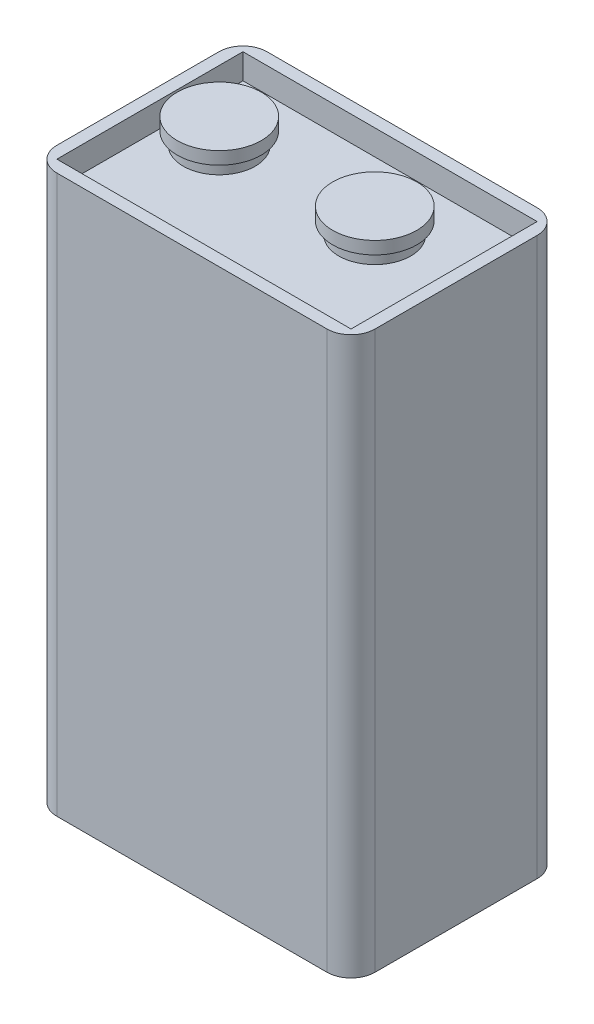
ISO-10303-21;
HEADER;
FILE_DESCRIPTION(('STEP AP214'),'2;1');
FILE_NAME('part.step','',(''),(''),'','','');
FILE_SCHEMA(('AUTOMOTIVE_DESIGN { 1 0 10303 214 1 1 1 1 }'));
ENDSEC;
DATA;
#1=APPLICATION_CONTEXT('core data for automotive mechanical design processes');
#2=APPLICATION_PROTOCOL_DEFINITION('international standard','automotive_design',2000,#1);
#3=PRODUCT_CONTEXT('',#1,'mechanical');
#4=PRODUCT('Part','Part','',(#3));
#5=PRODUCT_RELATED_PRODUCT_CATEGORY('part','',(#4));
#6=PRODUCT_DEFINITION_FORMATION('','',#4);
#7=PRODUCT_DEFINITION_CONTEXT('part definition',#1,'design');
#8=PRODUCT_DEFINITION('design','',#6,#7);
#9=PRODUCT_DEFINITION_SHAPE('','',#8);
#10=(LENGTH_UNIT() NAMED_UNIT(*) SI_UNIT(.MILLI.,.METRE.));
#11=(NAMED_UNIT(*) PLANE_ANGLE_UNIT() SI_UNIT($,.RADIAN.));
#12=(NAMED_UNIT(*) SI_UNIT($,.STERADIAN.) SOLID_ANGLE_UNIT());
#13=UNCERTAINTY_MEASURE_WITH_UNIT(LENGTH_MEASURE(1.E-05),#10,'distance_accuracy_value','');
#14=(GEOMETRIC_REPRESENTATION_CONTEXT(3) GLOBAL_UNCERTAINTY_ASSIGNED_CONTEXT((#13)) GLOBAL_UNIT_ASSIGNED_CONTEXT((#10,
#11,#12)) REPRESENTATION_CONTEXT('',''));
#15=CARTESIAN_POINT('',(0.,0.,0.));
#16=DIRECTION('',(0.,0.,1.));
#17=DIRECTION('',(1.,0.,0.));
#18=AXIS2_PLACEMENT_3D('',#15,#16,#17);
#19=CARTESIAN_POINT('',(1.,-2.1,-1.));
#20=DIRECTION('',(-1.,0.,0.));
#21=DIRECTION('',(0.,0.,1.));
#22=AXIS2_PLACEMENT_3D('',#19,#20,#21);
#23=PLANE('',#22);
#24=DIRECTION('',(0.,0.,1.));
#25=VECTOR('',#24,1.);
#26=CARTESIAN_POINT('',(1.,0.,-1.));
#27=LINE('',#26,#25);
#28=CARTESIAN_POINT('',(1.,0.,-16.5));
#29=VERTEX_POINT('',#28);
#30=CARTESIAN_POINT('',(1.,0.,-1.));
#31=VERTEX_POINT('',#30);
#32=EDGE_CURVE('E131',#29,#31,#27,.T.);
#33=ORIENTED_EDGE('',*,*,#32,.T.);
#34=DIRECTION('',(0.,1.,0.));
#35=VECTOR('',#34,1.);
#36=CARTESIAN_POINT('',(1.,-2.1,-1.));
#37=LINE('',#36,#35);
#38=CARTESIAN_POINT('',(1.,-2.1,-1.));
#39=VERTEX_POINT('',#38);
#40=EDGE_CURVE('E134',#39,#31,#37,.T.);
#41=ORIENTED_EDGE('',*,*,#40,.F.);
#42=DIRECTION('',(0.,0.,1.));
#43=VECTOR('',#42,1.);
#44=CARTESIAN_POINT('',(1.,-2.1,-1.));
#45=LINE('',#44,#43);
#46=CARTESIAN_POINT('',(1.,-2.1,-16.5));
#47=VERTEX_POINT('',#46);
#48=EDGE_CURVE('E150',#47,#39,#45,.T.);
#49=ORIENTED_EDGE('',*,*,#48,.F.);
#50=DIRECTION('',(0.,1.,0.));
#51=VECTOR('',#50,1.);
#52=CARTESIAN_POINT('',(1.,-2.1,-16.5));
#53=LINE('',#52,#51);
#54=EDGE_CURVE('E136',#47,#29,#53,.T.);
#55=ORIENTED_EDGE('',*,*,#54,.T.);
#56=EDGE_LOOP('',(#33,#41,#49,#55));
#57=FACE_BOUND('',#56,.T.);
#58=ADVANCED_FACE('F45',(#57),#23,.F.);
#59=CARTESIAN_POINT('',(1.,-2.1,-16.5));
#60=DIRECTION('',(0.,0.,-1.));
#61=DIRECTION('',(-1.,0.,0.));
#62=AXIS2_PLACEMENT_3D('',#59,#60,#61);
#63=PLANE('',#62);
#64=DIRECTION('',(-1.,0.,0.));
#65=VECTOR('',#64,1.);
#66=CARTESIAN_POINT('',(1.,0.,-16.5));
#67=LINE('',#66,#65);
#68=CARTESIAN_POINT('',(25.5,0.,-16.5));
#69=VERTEX_POINT('',#68);
#70=EDGE_CURVE('E230',#69,#29,#67,.T.);
#71=ORIENTED_EDGE('',*,*,#70,.T.);
#72=ORIENTED_EDGE('',*,*,#54,.F.);
#73=DIRECTION('',(-1.,0.,0.));
#74=VECTOR('',#73,1.);
#75=CARTESIAN_POINT('',(1.,-2.1,-16.5));
#76=LINE('',#75,#74);
#77=CARTESIAN_POINT('',(25.5,-2.1,-16.5));
#78=VERTEX_POINT('',#77);
#79=EDGE_CURVE('E161',#78,#47,#76,.T.);
#80=ORIENTED_EDGE('',*,*,#79,.F.);
#81=DIRECTION('',(0.,1.,0.));
#82=VECTOR('',#81,1.);
#83=CARTESIAN_POINT('',(25.5,-2.1,-16.5));
#84=LINE('',#83,#82);
#85=EDGE_CURVE('E228',#78,#69,#84,.T.);
#86=ORIENTED_EDGE('',*,*,#85,.T.);
#87=EDGE_LOOP('',(#71,#72,#80,#86));
#88=FACE_BOUND('',#87,.T.);
#89=ADVANCED_FACE('F232',(#88),#63,.F.);
#90=CARTESIAN_POINT('',(25.5,-2.1,-1.));
#91=DIRECTION('',(1.,0.,0.));
#92=DIRECTION('',(0.,0.,-1.));
#93=AXIS2_PLACEMENT_3D('',#90,#91,#92);
#94=PLANE('',#93);
#95=DIRECTION('',(0.,0.,-1.));
#96=VECTOR('',#95,1.);
#97=CARTESIAN_POINT('',(25.5,0.,-1.));
#98=LINE('',#97,#96);
#99=CARTESIAN_POINT('',(25.5,0.,-1.));
#100=VERTEX_POINT('',#99);
#101=EDGE_CURVE('E154',#100,#69,#98,.T.);
#102=ORIENTED_EDGE('',*,*,#101,.T.);
#103=ORIENTED_EDGE('',*,*,#85,.F.);
#104=DIRECTION('',(0.,0.,-1.));
#105=VECTOR('',#104,1.);
#106=CARTESIAN_POINT('',(25.5,-2.1,-1.));
#107=LINE('',#106,#105);
#108=CARTESIAN_POINT('',(25.5,-2.1,-1.));
#109=VERTEX_POINT('',#108);
#110=EDGE_CURVE('E165',#109,#78,#107,.T.);
#111=ORIENTED_EDGE('',*,*,#110,.F.);
#112=DIRECTION('',(0.,1.,0.));
#113=VECTOR('',#112,1.);
#114=CARTESIAN_POINT('',(25.5,-2.1,-1.));
#115=LINE('',#114,#113);
#116=EDGE_CURVE('E155',#109,#100,#115,.T.);
#117=ORIENTED_EDGE('',*,*,#116,.T.);
#118=EDGE_LOOP('',(#102,#103,#111,#117));
#119=FACE_BOUND('',#118,.T.);
#120=ADVANCED_FACE('F236',(#119),#94,.F.);
#121=CARTESIAN_POINT('',(1.,-2.1,-1.));
#122=DIRECTION('',(0.,0.,1.));
#123=DIRECTION('',(1.,0.,0.));
#124=AXIS2_PLACEMENT_3D('',#121,#122,#123);
#125=PLANE('',#124);
#126=DIRECTION('',(1.,0.,0.));
#127=VECTOR('',#126,1.);
#128=CARTESIAN_POINT('',(1.,0.,-1.));
#129=LINE('',#128,#127);
#130=EDGE_CURVE('E145',#31,#100,#129,.T.);
#131=ORIENTED_EDGE('',*,*,#130,.T.);
#132=ORIENTED_EDGE('',*,*,#116,.F.);
#133=DIRECTION('',(1.,0.,0.));
#134=VECTOR('',#133,1.);
#135=CARTESIAN_POINT('',(1.,-2.1,-1.));
#136=LINE('',#135,#134);
#137=EDGE_CURVE('E148',#39,#109,#136,.T.);
#138=ORIENTED_EDGE('',*,*,#137,.F.);
#139=ORIENTED_EDGE('',*,*,#40,.T.);
#140=EDGE_LOOP('',(#131,#132,#138,#139));
#141=FACE_BOUND('',#140,.T.);
#142=ADVANCED_FACE('F144',(#141),#125,.F.);
#143=CARTESIAN_POINT('',(0.,-2.1,0.));
#144=DIRECTION('',(0.,-1.,0.));
#145=DIRECTION('',(0.,0.,-1.));
#146=AXIS2_PLACEMENT_3D('',#143,#144,#145);
#147=PLANE('',#146);
#148=ORIENTED_EDGE('',*,*,#48,.T.);
#149=ORIENTED_EDGE('',*,*,#137,.T.);
#150=ORIENTED_EDGE('',*,*,#110,.T.);
#151=ORIENTED_EDGE('',*,*,#79,.T.);
#152=EDGE_LOOP('',(#148,#149,#150,#151));
#153=FACE_BOUND('',#152,.T.);
#154=ADVANCED_FACE('F238',(#153),#147,.F.);
#155=CARTESIAN_POINT('',(0.,-46.4,0.));
#156=DIRECTION('',(0.,-1.,0.));
#157=DIRECTION('',(0.,0.,-1.));
#158=AXIS2_PLACEMENT_3D('',#155,#156,#157);
#159=PLANE('',#158);
#160=DIRECTION('',(1.,0.,0.));
#161=VECTOR('',#160,1.);
#162=CARTESIAN_POINT('',(0.,-46.4,0.));
#163=LINE('',#162,#161);
#164=CARTESIAN_POINT('',(2.,-46.4,0.));
#165=VERTEX_POINT('',#164);
#166=CARTESIAN_POINT('',(24.5,-46.4,0.));
#167=VERTEX_POINT('',#166);
#168=EDGE_CURVE('E218',#165,#167,#163,.T.);
#169=ORIENTED_EDGE('',*,*,#168,.F.);
#170=CARTESIAN_POINT('',(2.,-46.4,-2.));
#171=DIRECTION('',(0.,-1.,0.));
#172=DIRECTION('',(0.,0.,-1.));
#173=AXIS2_PLACEMENT_3D('',#170,#171,#172);
#174=CIRCLE('',#173,2.);
#175=CARTESIAN_POINT('',(0.,-46.4,-2.));
#176=VERTEX_POINT('',#175);
#177=EDGE_CURVE('E12',#165,#176,#174,.T.);
#178=ORIENTED_EDGE('',*,*,#177,.T.);
#179=DIRECTION('',(0.,0.,1.));
#180=VECTOR('',#179,1.);
#181=CARTESIAN_POINT('',(0.,-46.4,0.));
#182=LINE('',#181,#180);
#183=CARTESIAN_POINT('',(0.,-46.4,-15.5));
#184=VERTEX_POINT('',#183);
#185=EDGE_CURVE('E210',#184,#176,#182,.T.);
#186=ORIENTED_EDGE('',*,*,#185,.F.);
#187=CARTESIAN_POINT('',(2.,-46.4,-15.5));
#188=DIRECTION('',(0.,-1.,0.));
#189=DIRECTION('',(0.,0.,-1.));
#190=AXIS2_PLACEMENT_3D('',#187,#188,#189);
#191=CIRCLE('',#190,2.);
#192=CARTESIAN_POINT('',(2.,-46.4,-17.5));
#193=VERTEX_POINT('',#192);
#194=EDGE_CURVE('E197',#184,#193,#191,.T.);
#195=ORIENTED_EDGE('',*,*,#194,.T.);
#196=DIRECTION('',(-1.,0.,0.));
#197=VECTOR('',#196,1.);
#198=CARTESIAN_POINT('',(0.,-46.4,-17.5));
#199=LINE('',#198,#197);
#200=CARTESIAN_POINT('',(24.5,-46.4,-17.5));
#201=VERTEX_POINT('',#200);
#202=EDGE_CURVE('E164',#201,#193,#199,.T.);
#203=ORIENTED_EDGE('',*,*,#202,.F.);
#204=CARTESIAN_POINT('',(24.5,-46.4,-15.5));
#205=DIRECTION('',(0.,-1.,0.));
#206=DIRECTION('',(0.,0.,-1.));
#207=AXIS2_PLACEMENT_3D('',#204,#205,#206);
#208=CIRCLE('',#207,2.);
#209=CARTESIAN_POINT('',(26.5,-46.4,-15.5));
#210=VERTEX_POINT('',#209);
#211=EDGE_CURVE('E188',#201,#210,#208,.T.);
#212=ORIENTED_EDGE('',*,*,#211,.T.);
#213=DIRECTION('',(0.,0.,-1.));
#214=VECTOR('',#213,1.);
#215=CARTESIAN_POINT('',(26.5,-46.4,0.));
#216=LINE('',#215,#214);
#217=CARTESIAN_POINT('',(26.5,-46.4,-2.));
#218=VERTEX_POINT('',#217);
#219=EDGE_CURVE('E224',#218,#210,#216,.T.);
#220=ORIENTED_EDGE('',*,*,#219,.F.);
#221=CARTESIAN_POINT('',(24.5,-46.4,-2.));
#222=DIRECTION('',(0.,-1.,0.));
#223=DIRECTION('',(0.,0.,-1.));
#224=AXIS2_PLACEMENT_3D('',#221,#222,#223);
#225=CIRCLE('',#224,2.);
#226=EDGE_CURVE('E178',#218,#167,#225,.T.);
#227=ORIENTED_EDGE('',*,*,#226,.T.);
#228=EDGE_LOOP('',(#169,#178,#186,#195,#203,#212,#220,#227));
#229=FACE_BOUND('',#228,.T.);
#230=ADVANCED_FACE('F240',(#229),#159,.T.);
#231=CARTESIAN_POINT('',(0.,-46.4,-17.5));
#232=DIRECTION('',(0.,0.,-1.));
#233=DIRECTION('',(-1.,0.,0.));
#234=AXIS2_PLACEMENT_3D('',#231,#232,#233);
#235=PLANE('',#234);
#236=ORIENTED_EDGE('',*,*,#202,.T.);
#237=DIRECTION('',(0.,1.,0.));
#238=VECTOR('',#237,1.);
#239=CARTESIAN_POINT('',(2.,-46.4,-17.5));
#240=LINE('',#239,#238);
#241=CARTESIAN_POINT('',(2.,0.,-17.5));
#242=VERTEX_POINT('',#241);
#243=EDGE_CURVE('E190',#193,#242,#240,.T.);
#244=ORIENTED_EDGE('',*,*,#243,.T.);
#245=DIRECTION('',(-1.,0.,0.));
#246=VECTOR('',#245,1.);
#247=CARTESIAN_POINT('',(0.,0.,-17.5));
#248=LINE('',#247,#246);
#249=CARTESIAN_POINT('',(24.5,0.,-17.5));
#250=VERTEX_POINT('',#249);
#251=EDGE_CURVE('E174',#250,#242,#248,.T.);
#252=ORIENTED_EDGE('',*,*,#251,.F.);
#253=DIRECTION('',(0.,1.,0.));
#254=VECTOR('',#253,1.);
#255=CARTESIAN_POINT('',(24.5,-46.4,-17.5));
#256=LINE('',#255,#254);
#257=EDGE_CURVE('E186',#250,#201,#256,.F.);
#258=ORIENTED_EDGE('',*,*,#257,.T.);
#259=EDGE_LOOP('',(#236,#244,#252,#258));
#260=FACE_BOUND('',#259,.T.);
#261=ADVANCED_FACE('F246',(#260),#235,.T.);
#262=CARTESIAN_POINT('',(26.5,-46.4,0.));
#263=DIRECTION('',(1.,0.,0.));
#264=DIRECTION('',(0.,0.,-1.));
#265=AXIS2_PLACEMENT_3D('',#262,#263,#264);
#266=PLANE('',#265);
#267=ORIENTED_EDGE('',*,*,#219,.T.);
#268=DIRECTION('',(0.,1.,0.));
#269=VECTOR('',#268,1.);
#270=CARTESIAN_POINT('',(26.5,-46.4,-15.5));
#271=LINE('',#270,#269);
#272=CARTESIAN_POINT('',(26.5,0.,-15.5));
#273=VERTEX_POINT('',#272);
#274=EDGE_CURVE('E181',#210,#273,#271,.T.);
#275=ORIENTED_EDGE('',*,*,#274,.T.);
#276=DIRECTION('',(0.,0.,-1.));
#277=VECTOR('',#276,1.);
#278=CARTESIAN_POINT('',(26.5,0.,0.));
#279=LINE('',#278,#277);
#280=CARTESIAN_POINT('',(26.5,0.,-2.));
#281=VERTEX_POINT('',#280);
#282=EDGE_CURVE('E216',#281,#273,#279,.T.);
#283=ORIENTED_EDGE('',*,*,#282,.F.);
#284=DIRECTION('',(0.,1.,0.));
#285=VECTOR('',#284,1.);
#286=CARTESIAN_POINT('',(26.5,-46.4,-2.));
#287=LINE('',#286,#285);
#288=EDGE_CURVE('E176',#281,#218,#287,.F.);
#289=ORIENTED_EDGE('',*,*,#288,.T.);
#290=EDGE_LOOP('',(#267,#275,#283,#289));
#291=FACE_BOUND('',#290,.T.);
#292=ADVANCED_FACE('F293',(#291),#266,.T.);
#293=CARTESIAN_POINT('',(0.,-46.4,0.));
#294=DIRECTION('',(0.,0.,1.));
#295=DIRECTION('',(1.,0.,0.));
#296=AXIS2_PLACEMENT_3D('',#293,#294,#295);
#297=PLANE('',#296);
#298=DIRECTION('',(1.,0.,0.));
#299=VECTOR('',#298,1.);
#300=CARTESIAN_POINT('',(0.,0.,0.));
#301=LINE('',#300,#299);
#302=CARTESIAN_POINT('',(2.,0.,0.));
#303=VERTEX_POINT('',#302);
#304=CARTESIAN_POINT('',(24.5,0.,0.));
#305=VERTEX_POINT('',#304);
#306=EDGE_CURVE('E214',#303,#305,#301,.T.);
#307=ORIENTED_EDGE('',*,*,#306,.F.);
#308=DIRECTION('',(0.,1.,0.));
#309=VECTOR('',#308,1.);
#310=CARTESIAN_POINT('',(2.,-46.4,0.));
#311=LINE('',#310,#309);
#312=EDGE_CURVE('E53',#303,#165,#311,.F.);
#313=ORIENTED_EDGE('',*,*,#312,.T.);
#314=ORIENTED_EDGE('',*,*,#168,.T.);
#315=DIRECTION('',(0.,1.,0.));
#316=VECTOR('',#315,1.);
#317=CARTESIAN_POINT('',(24.5,-46.4,0.));
#318=LINE('',#317,#316);
#319=EDGE_CURVE('E170',#167,#305,#318,.T.);
#320=ORIENTED_EDGE('',*,*,#319,.T.);
#321=EDGE_LOOP('',(#307,#313,#314,#320));
#322=FACE_BOUND('',#321,.T.);
#323=ADVANCED_FACE('F298',(#322),#297,.T.);
#324=CARTESIAN_POINT('',(0.,-46.4,0.));
#325=DIRECTION('',(-1.,0.,0.));
#326=DIRECTION('',(0.,0.,1.));
#327=AXIS2_PLACEMENT_3D('',#324,#325,#326);
#328=PLANE('',#327);
#329=ORIENTED_EDGE('',*,*,#185,.T.);
#330=DIRECTION('',(0.,1.,0.));
#331=VECTOR('',#330,1.);
#332=CARTESIAN_POINT('',(0.,-46.4,-2.));
#333=LINE('',#332,#331);
#334=CARTESIAN_POINT('',(0.,0.,-2.));
#335=VERTEX_POINT('',#334);
#336=EDGE_CURVE('E199',#176,#335,#333,.T.);
#337=ORIENTED_EDGE('',*,*,#336,.T.);
#338=DIRECTION('',(0.,0.,1.));
#339=VECTOR('',#338,1.);
#340=CARTESIAN_POINT('',(0.,0.,0.));
#341=LINE('',#340,#339);
#342=CARTESIAN_POINT('',(0.,0.,-15.5));
#343=VERTEX_POINT('',#342);
#344=EDGE_CURVE('E207',#343,#335,#341,.T.);
#345=ORIENTED_EDGE('',*,*,#344,.F.);
#346=DIRECTION('',(0.,1.,0.));
#347=VECTOR('',#346,1.);
#348=CARTESIAN_POINT('',(0.,-46.4,-15.5));
#349=LINE('',#348,#347);
#350=EDGE_CURVE('E195',#343,#184,#349,.F.);
#351=ORIENTED_EDGE('',*,*,#350,.T.);
#352=EDGE_LOOP('',(#329,#337,#345,#351));
#353=FACE_BOUND('',#352,.T.);
#354=ADVANCED_FACE('F206',(#353),#328,.T.);
#355=CARTESIAN_POINT('',(0.,0.,0.));
#356=DIRECTION('',(0.,-1.,0.));
#357=DIRECTION('',(0.,0.,-1.));
#358=AXIS2_PLACEMENT_3D('',#355,#356,#357);
#359=PLANE('',#358);
#360=ORIENTED_EDGE('',*,*,#130,.F.);
#361=ORIENTED_EDGE('',*,*,#32,.F.);
#362=ORIENTED_EDGE('',*,*,#70,.F.);
#363=ORIENTED_EDGE('',*,*,#101,.F.);
#364=EDGE_LOOP('',(#360,#361,#362,#363));
#365=FACE_BOUND('',#364,.T.);
#366=ORIENTED_EDGE('',*,*,#344,.T.);
#367=CARTESIAN_POINT('',(2.,0.,-2.));
#368=DIRECTION('',(0.,-1.,0.));
#369=DIRECTION('',(0.,0.,-1.));
#370=AXIS2_PLACEMENT_3D('',#367,#368,#369);
#371=CIRCLE('',#370,2.);
#372=EDGE_CURVE('E67',#335,#303,#371,.F.);
#373=ORIENTED_EDGE('',*,*,#372,.T.);
#374=ORIENTED_EDGE('',*,*,#306,.T.);
#375=CARTESIAN_POINT('',(24.5,0.,-2.));
#376=DIRECTION('',(0.,-1.,0.));
#377=DIRECTION('',(0.,0.,-1.));
#378=AXIS2_PLACEMENT_3D('',#375,#376,#377);
#379=CIRCLE('',#378,2.);
#380=EDGE_CURVE('E173',#305,#281,#379,.F.);
#381=ORIENTED_EDGE('',*,*,#380,.T.);
#382=ORIENTED_EDGE('',*,*,#282,.T.);
#383=CARTESIAN_POINT('',(24.5,0.,-15.5));
#384=DIRECTION('',(0.,-1.,0.));
#385=DIRECTION('',(0.,0.,-1.));
#386=AXIS2_PLACEMENT_3D('',#383,#384,#385);
#387=CIRCLE('',#386,2.);
#388=EDGE_CURVE('E184',#273,#250,#387,.F.);
#389=ORIENTED_EDGE('',*,*,#388,.T.);
#390=ORIENTED_EDGE('',*,*,#251,.T.);
#391=CARTESIAN_POINT('',(2.,0.,-15.5));
#392=DIRECTION('',(0.,-1.,0.));
#393=DIRECTION('',(0.,0.,-1.));
#394=AXIS2_PLACEMENT_3D('',#391,#392,#393);
#395=CIRCLE('',#394,2.);
#396=EDGE_CURVE('E193',#242,#343,#395,.F.);
#397=ORIENTED_EDGE('',*,*,#396,.T.);
#398=EDGE_LOOP('',(#366,#373,#374,#381,#382,#389,#390,#397));
#399=FACE_BOUND('',#398,.T.);
#400=ADVANCED_FACE('F152',(#365,#399),#359,.F.);
#401=CARTESIAN_POINT('',(24.5,-46.4,-2.));
#402=DIRECTION('',(0.,1.,0.));
#403=DIRECTION('',(0.,0.,1.));
#404=AXIS2_PLACEMENT_3D('',#401,#402,#403);
#405=CYLINDRICAL_SURFACE('',#404,2.);
#406=ORIENTED_EDGE('',*,*,#226,.F.);
#407=ORIENTED_EDGE('',*,*,#288,.F.);
#408=ORIENTED_EDGE('',*,*,#380,.F.);
#409=ORIENTED_EDGE('',*,*,#319,.F.);
#410=EDGE_LOOP('',(#406,#407,#408,#409));
#411=FACE_BOUND('',#410,.T.);
#412=ADVANCED_FACE('F281',(#411),#405,.T.);
#413=CARTESIAN_POINT('',(24.5,-46.4,-15.5));
#414=DIRECTION('',(0.,1.,0.));
#415=DIRECTION('',(0.,0.,1.));
#416=AXIS2_PLACEMENT_3D('',#413,#414,#415);
#417=CYLINDRICAL_SURFACE('',#416,2.);
#418=ORIENTED_EDGE('',*,*,#211,.F.);
#419=ORIENTED_EDGE('',*,*,#257,.F.);
#420=ORIENTED_EDGE('',*,*,#388,.F.);
#421=ORIENTED_EDGE('',*,*,#274,.F.);
#422=EDGE_LOOP('',(#418,#419,#420,#421));
#423=FACE_BOUND('',#422,.T.);
#424=ADVANCED_FACE('F285',(#423),#417,.T.);
#425=CARTESIAN_POINT('',(2.,-46.4,-15.5));
#426=DIRECTION('',(0.,1.,0.));
#427=DIRECTION('',(0.,0.,1.));
#428=AXIS2_PLACEMENT_3D('',#425,#426,#427);
#429=CYLINDRICAL_SURFACE('',#428,2.);
#430=ORIENTED_EDGE('',*,*,#194,.F.);
#431=ORIENTED_EDGE('',*,*,#350,.F.);
#432=ORIENTED_EDGE('',*,*,#396,.F.);
#433=ORIENTED_EDGE('',*,*,#243,.F.);
#434=EDGE_LOOP('',(#430,#431,#432,#433));
#435=FACE_BOUND('',#434,.T.);
#436=ADVANCED_FACE('F308',(#435),#429,.T.);
#437=CARTESIAN_POINT('',(2.,-46.4,-2.));
#438=DIRECTION('',(0.,1.,0.));
#439=DIRECTION('',(0.,0.,1.));
#440=AXIS2_PLACEMENT_3D('',#437,#438,#439);
#441=CYLINDRICAL_SURFACE('',#440,2.);
#442=ORIENTED_EDGE('',*,*,#177,.F.);
#443=ORIENTED_EDGE('',*,*,#312,.F.);
#444=ORIENTED_EDGE('',*,*,#372,.F.);
#445=ORIENTED_EDGE('',*,*,#336,.F.);
#446=EDGE_LOOP('',(#442,#443,#444,#445));
#447=FACE_BOUND('',#446,.T.);
#448=ADVANCED_FACE('F47',(#447),#441,.T.);
#449=CLOSED_SHELL('',(#58,#89,#120,#142,#154,#230,#261,#292,#323,#354,#400,#412,#424,#436,#448));
#450=MANIFOLD_SOLID_BREP('B2',#449);
#451=CARTESIAN_POINT('',(19.725,1.05,-8.75));
#452=DIRECTION('',(0.,-1.,0.));
#453=DIRECTION('',(0.,0.,-1.));
#454=AXIS2_PLACEMENT_3D('',#451,#452,#453);
#455=CYLINDRICAL_SURFACE('',#454,3.);
#456=CARTESIAN_POINT('',(19.725,1.05,-8.75));
#457=DIRECTION('',(0.,1.,0.));
#458=DIRECTION('',(0.,0.,1.));
#459=AXIS2_PLACEMENT_3D('',#456,#457,#458);
#460=CIRCLE('',#459,3.);
#461=CARTESIAN_POINT('',(19.725,1.05,-5.75000000000001));
#462=VERTEX_POINT('',#461);
#463=EDGE_CURVE('E405',#462,#462,#460,.T.);
#464=ORIENTED_EDGE('',*,*,#463,.F.);
#465=EDGE_LOOP('',(#464));
#466=FACE_BOUND('',#465,.T.);
#467=CARTESIAN_POINT('',(19.725,0.,-8.75));
#468=DIRECTION('',(0.,-1.,0.));
#469=DIRECTION('',(0.,0.,-1.));
#470=AXIS2_PLACEMENT_3D('',#467,#468,#469);
#471=CIRCLE('',#470,3.);
#472=CARTESIAN_POINT('',(19.725,0.,-11.75));
#473=VERTEX_POINT('',#472);
#474=EDGE_CURVE('E44',#473,#473,#471,.T.);
#475=ORIENTED_EDGE('',*,*,#474,.F.);
#476=EDGE_LOOP('',(#475));
#477=FACE_BOUND('',#476,.T.);
#478=ADVANCED_FACE('F398',(#466,#477),#455,.T.);
#479=CARTESIAN_POINT('',(19.725,2.1,-8.75));
#480=DIRECTION('',(0.,-1.,0.));
#481=DIRECTION('',(0.,0.,-1.));
#482=AXIS2_PLACEMENT_3D('',#479,#480,#481);
#483=CYLINDRICAL_SURFACE('',#482,3.5);
#484=CARTESIAN_POINT('',(19.725,2.1,-8.75));
#485=DIRECTION('',(0.,1.,0.));
#486=DIRECTION('',(0.,0.,1.));
#487=AXIS2_PLACEMENT_3D('',#484,#485,#486);
#488=CIRCLE('',#487,3.5);
#489=CARTESIAN_POINT('',(19.725,2.1,-5.25));
#490=VERTEX_POINT('',#489);
#491=EDGE_CURVE('E409',#490,#490,#488,.T.);
#492=ORIENTED_EDGE('',*,*,#491,.F.);
#493=EDGE_LOOP('',(#492));
#494=FACE_BOUND('',#493,.T.);
#495=CARTESIAN_POINT('',(19.725,1.05,-8.75));
#496=DIRECTION('',(0.,1.,0.));
#497=DIRECTION('',(0.,0.,1.));
#498=AXIS2_PLACEMENT_3D('',#495,#496,#497);
#499=CIRCLE('',#498,3.5);
#500=CARTESIAN_POINT('',(19.725,1.05,-5.25));
#501=VERTEX_POINT('',#500);
#502=EDGE_CURVE('E414',#501,#501,#499,.T.);
#503=ORIENTED_EDGE('',*,*,#502,.T.);
#504=EDGE_LOOP('',(#503));
#505=FACE_BOUND('',#504,.T.);
#506=ADVANCED_FACE('F419',(#494,#505),#483,.T.);
#507=CARTESIAN_POINT('',(19.725,2.1,-8.75));
#508=DIRECTION('',(0.,1.,0.));
#509=DIRECTION('',(0.,0.,1.));
#510=AXIS2_PLACEMENT_3D('',#507,#508,#509);
#511=PLANE('',#510);
#512=ORIENTED_EDGE('',*,*,#491,.T.);
#513=EDGE_LOOP('',(#512));
#514=FACE_BOUND('',#513,.T.);
#515=ADVANCED_FACE('F423',(#514),#511,.T.);
#516=CARTESIAN_POINT('',(19.725,1.05,-8.75));
#517=DIRECTION('',(0.,1.,0.));
#518=DIRECTION('',(0.,0.,1.));
#519=AXIS2_PLACEMENT_3D('',#516,#517,#518);
#520=PLANE('',#519);
#521=ORIENTED_EDGE('',*,*,#463,.T.);
#522=EDGE_LOOP('',(#521));
#523=FACE_BOUND('',#522,.T.);
#524=ORIENTED_EDGE('',*,*,#502,.F.);
#525=EDGE_LOOP('',(#524));
#526=FACE_BOUND('',#525,.T.);
#527=ADVANCED_FACE('F421',(#523,#526),#520,.F.);
#528=CARTESIAN_POINT('',(0.,0.,0.));
#529=DIRECTION('',(0.,-1.,0.));
#530=DIRECTION('',(0.,0.,-1.));
#531=AXIS2_PLACEMENT_3D('',#528,#529,#530);
#532=PLANE('',#531);
#533=ORIENTED_EDGE('',*,*,#474,.T.);
#534=EDGE_LOOP('',(#533));
#535=FACE_BOUND('',#534,.T.);
#536=ADVANCED_FACE('F400',(#535),#532,.T.);
#537=CLOSED_SHELL('',(#478,#506,#515,#527,#536));
#538=MANIFOLD_SOLID_BREP('B6',#537);
#539=CARTESIAN_POINT('',(6.775,2.1,-8.75));
#540=DIRECTION('',(0.,1.,0.));
#541=DIRECTION('',(0.,0.,1.));
#542=AXIS2_PLACEMENT_3D('',#539,#540,#541);
#543=PLANE('',#542);
#544=CARTESIAN_POINT('',(6.775,2.1,-8.75));
#545=DIRECTION('',(0.,1.,0.));
#546=DIRECTION('',(0.,0.,1.));
#547=AXIS2_PLACEMENT_3D('',#544,#545,#546);
#548=CIRCLE('',#547,3.5);
#549=CARTESIAN_POINT('',(6.775,2.1,-5.25));
#550=VERTEX_POINT('',#549);
#551=EDGE_CURVE('E477',#550,#550,#548,.T.);
#552=ORIENTED_EDGE('',*,*,#551,.T.);
#553=EDGE_LOOP('',(#552));
#554=FACE_BOUND('',#553,.T.);
#555=ADVANCED_FACE('F470',(#554),#543,.T.);
#556=CARTESIAN_POINT('',(6.775,2.1,-8.75));
#557=DIRECTION('',(0.,-1.,0.));
#558=DIRECTION('',(0.,0.,-1.));
#559=AXIS2_PLACEMENT_3D('',#556,#557,#558);
#560=CYLINDRICAL_SURFACE('',#559,3.5);
#561=ORIENTED_EDGE('',*,*,#551,.F.);
#562=EDGE_LOOP('',(#561));
#563=FACE_BOUND('',#562,.T.);
#564=CARTESIAN_POINT('',(6.775,1.05,-8.75));
#565=DIRECTION('',(0.,1.,0.));
#566=DIRECTION('',(0.,0.,1.));
#567=AXIS2_PLACEMENT_3D('',#564,#565,#566);
#568=CIRCLE('',#567,3.5);
#569=CARTESIAN_POINT('',(6.775,1.05,-5.25));
#570=VERTEX_POINT('',#569);
#571=EDGE_CURVE('E481',#570,#570,#568,.T.);
#572=ORIENTED_EDGE('',*,*,#571,.T.);
#573=EDGE_LOOP('',(#572));
#574=FACE_BOUND('',#573,.T.);
#575=ADVANCED_FACE('F501',(#563,#574),#560,.T.);
#576=CARTESIAN_POINT('',(6.775,1.05,-8.75));
#577=DIRECTION('',(0.,1.,0.));
#578=DIRECTION('',(0.,0.,1.));
#579=AXIS2_PLACEMENT_3D('',#576,#577,#578);
#580=PLANE('',#579);
#581=CARTESIAN_POINT('',(6.775,1.05,-8.75));
#582=DIRECTION('',(0.,1.,0.));
#583=DIRECTION('',(0.,0.,1.));
#584=AXIS2_PLACEMENT_3D('',#581,#582,#583);
#585=CIRCLE('',#584,3.);
#586=CARTESIAN_POINT('',(6.775,1.05,-5.75000000000001));
#587=VERTEX_POINT('',#586);
#588=EDGE_CURVE('E397',#587,#587,#585,.T.);
#589=ORIENTED_EDGE('',*,*,#588,.T.);
#590=EDGE_LOOP('',(#589));
#591=FACE_BOUND('',#590,.T.);
#592=ORIENTED_EDGE('',*,*,#571,.F.);
#593=EDGE_LOOP('',(#592));
#594=FACE_BOUND('',#593,.T.);
#595=ADVANCED_FACE('F494',(#591,#594),#580,.F.);
#596=CARTESIAN_POINT('',(6.775,1.05,-8.75));
#597=DIRECTION('',(0.,-1.,0.));
#598=DIRECTION('',(0.,0.,-1.));
#599=AXIS2_PLACEMENT_3D('',#596,#597,#598);
#600=CYLINDRICAL_SURFACE('',#599,3.);
#601=ORIENTED_EDGE('',*,*,#588,.F.);
#602=EDGE_LOOP('',(#601));
#603=FACE_BOUND('',#602,.T.);
#604=CARTESIAN_POINT('',(6.775,0.,-8.75));
#605=DIRECTION('',(0.,-1.,0.));
#606=DIRECTION('',(0.,0.,-1.));
#607=AXIS2_PLACEMENT_3D('',#604,#605,#606);
#608=CIRCLE('',#607,3.);
#609=CARTESIAN_POINT('',(6.775,0.,-11.75));
#610=VERTEX_POINT('',#609);
#611=EDGE_CURVE('E486',#610,#610,#608,.T.);
#612=ORIENTED_EDGE('',*,*,#611,.F.);
#613=EDGE_LOOP('',(#612));
#614=FACE_BOUND('',#613,.T.);
#615=ADVANCED_FACE('F472',(#603,#614),#600,.T.);
#616=CARTESIAN_POINT('',(0.,0.,0.));
#617=DIRECTION('',(0.,-1.,0.));
#618=DIRECTION('',(0.,0.,-1.));
#619=AXIS2_PLACEMENT_3D('',#616,#617,#618);
#620=PLANE('',#619);
#621=ORIENTED_EDGE('',*,*,#611,.T.);
#622=EDGE_LOOP('',(#621));
#623=FACE_BOUND('',#622,.T.);
#624=ADVANCED_FACE('F491',(#623),#620,.T.);
#625=CLOSED_SHELL('',(#555,#575,#595,#615,#624));
#626=MANIFOLD_SOLID_BREP('B39',#625);
#627=ADVANCED_BREP_SHAPE_REPRESENTATION('',(#18,#450,#538,#626),#14);
#628=SHAPE_DEFINITION_REPRESENTATION(#9,#627);
ENDSEC;
END-ISO-10303-21;
